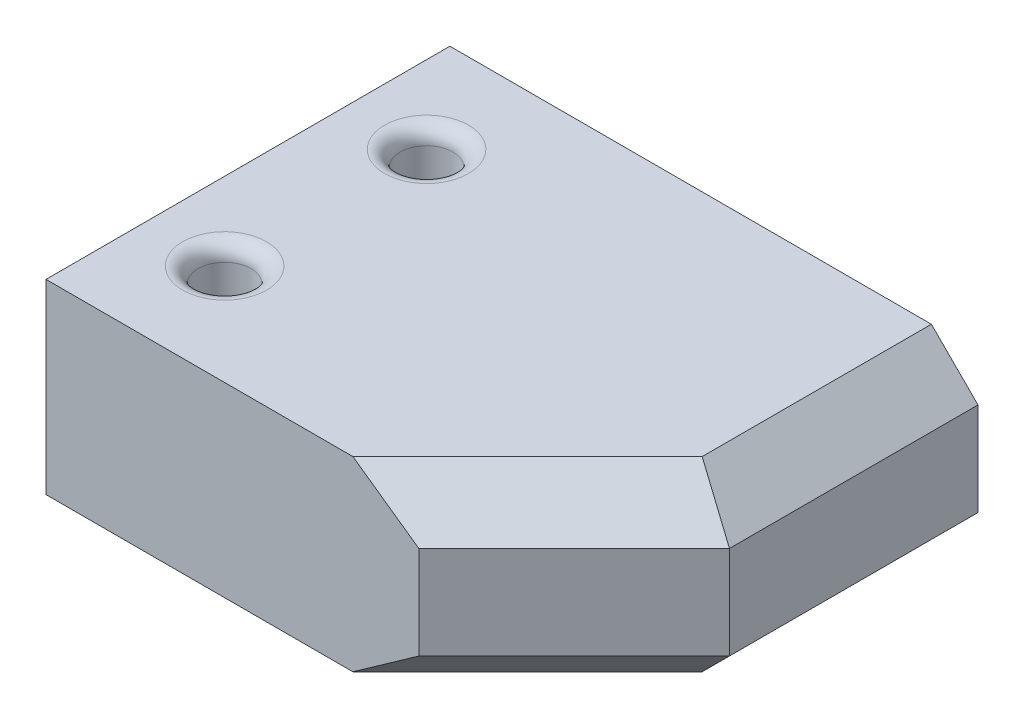
ISO-10303-21;
HEADER;
FILE_DESCRIPTION(('STEP AP214'),'2;1');
FILE_NAME('part.step','',(''),(''),'','','');
FILE_SCHEMA(('AUTOMOTIVE_DESIGN { 1 0 10303 214 1 1 1 1 }'));
ENDSEC;
DATA;
#1=APPLICATION_CONTEXT('core data for automotive mechanical design processes');
#2=APPLICATION_PROTOCOL_DEFINITION('international standard','automotive_design',2000,#1);
#3=PRODUCT_CONTEXT('',#1,'mechanical');
#4=PRODUCT('Part','Part','',(#3));
#5=PRODUCT_RELATED_PRODUCT_CATEGORY('part','',(#4));
#6=PRODUCT_DEFINITION_FORMATION('','',#4);
#7=PRODUCT_DEFINITION_CONTEXT('part definition',#1,'design');
#8=PRODUCT_DEFINITION('design','',#6,#7);
#9=PRODUCT_DEFINITION_SHAPE('','',#8);
#10=(LENGTH_UNIT() NAMED_UNIT(*) SI_UNIT(.MILLI.,.METRE.));
#11=(NAMED_UNIT(*) PLANE_ANGLE_UNIT() SI_UNIT($,.RADIAN.));
#12=(NAMED_UNIT(*) SI_UNIT($,.STERADIAN.) SOLID_ANGLE_UNIT());
#13=UNCERTAINTY_MEASURE_WITH_UNIT(LENGTH_MEASURE(1.E-05),#10,'distance_accuracy_value','');
#14=(GEOMETRIC_REPRESENTATION_CONTEXT(3) GLOBAL_UNCERTAINTY_ASSIGNED_CONTEXT((#13)) GLOBAL_UNIT_ASSIGNED_CONTEXT((#10,
#11,#12)) REPRESENTATION_CONTEXT('',''));
#15=CARTESIAN_POINT('',(0.,0.,0.));
#16=DIRECTION('',(0.,0.,1.));
#17=DIRECTION('',(1.,0.,0.));
#18=AXIS2_PLACEMENT_3D('',#15,#16,#17);
#19=CARTESIAN_POINT('',(0.,6.,-6.5));
#20=DIRECTION('',(0.,0.,1.));
#21=DIRECTION('',(1.,0.,0.));
#22=AXIS2_PLACEMENT_3D('',#19,#20,#21);
#23=PLANE('',#22);
#24=DIRECTION('',(0.,-1.,0.));
#25=VECTOR('',#24,1.);
#26=CARTESIAN_POINT('',(17.,6.,-6.5));
#27=LINE('',#26,#25);
#28=CARTESIAN_POINT('',(17.,4.5,-6.5));
#29=VERTEX_POINT('',#28);
#30=CARTESIAN_POINT('',(17.,1.5,-6.5));
#31=VERTEX_POINT('',#30);
#32=EDGE_CURVE('E128',#29,#31,#27,.T.);
#33=ORIENTED_EDGE('',*,*,#32,.T.);
#34=DIRECTION('',(-0.707106781186546,-0.707106781186549,0.));
#35=VECTOR('',#34,1.);
#36=CARTESIAN_POINT('',(17.,1.5,-6.5));
#37=LINE('',#36,#35);
#38=CARTESIAN_POINT('',(15.5,0.,-6.5));
#39=VERTEX_POINT('',#38);
#40=EDGE_CURVE('E164',#31,#39,#37,.T.);
#41=ORIENTED_EDGE('',*,*,#40,.T.);
#42=DIRECTION('',(-1.,0.,0.));
#43=VECTOR('',#42,1.);
#44=CARTESIAN_POINT('',(0.,0.,-6.5));
#45=LINE('',#44,#43);
#46=CARTESIAN_POINT('',(0.,0.,-6.5));
#47=VERTEX_POINT('',#46);
#48=EDGE_CURVE('E121',#39,#47,#45,.T.);
#49=ORIENTED_EDGE('',*,*,#48,.T.);
#50=DIRECTION('',(0.,-1.,0.));
#51=VECTOR('',#50,1.);
#52=CARTESIAN_POINT('',(0.,6.,-6.5));
#53=LINE('',#52,#51);
#54=CARTESIAN_POINT('',(0.,6.,-6.5));
#55=VERTEX_POINT('',#54);
#56=EDGE_CURVE('E114',#55,#47,#53,.T.);
#57=ORIENTED_EDGE('',*,*,#56,.F.);
#58=DIRECTION('',(-1.,0.,0.));
#59=VECTOR('',#58,1.);
#60=CARTESIAN_POINT('',(0.,6.,-6.5));
#61=LINE('',#60,#59);
#62=CARTESIAN_POINT('',(15.5,6.,-6.5));
#63=VERTEX_POINT('',#62);
#64=EDGE_CURVE('E101',#63,#55,#61,.T.);
#65=ORIENTED_EDGE('',*,*,#64,.F.);
#66=DIRECTION('',(-0.707106781186546,0.707106781186549,0.));
#67=VECTOR('',#66,1.);
#68=CARTESIAN_POINT('',(15.5,6.,-6.5));
#69=LINE('',#68,#67);
#70=EDGE_CURVE('E162',#63,#29,#69,.F.);
#71=ORIENTED_EDGE('',*,*,#70,.T.);
#72=EDGE_LOOP('',(#33,#41,#49,#57,#65,#71));
#73=FACE_BOUND('',#72,.T.);
#74=ADVANCED_FACE('F34',(#73),#23,.F.);
#75=CARTESIAN_POINT('',(0.,6.,6.5));
#76=DIRECTION('',(1.,0.,0.));
#77=DIRECTION('',(0.,0.,-1.));
#78=AXIS2_PLACEMENT_3D('',#75,#76,#77);
#79=PLANE('',#78);
#80=DIRECTION('',(0.,0.,1.));
#81=VECTOR('',#80,1.);
#82=CARTESIAN_POINT('',(0.,0.,6.5));
#83=LINE('',#82,#81);
#84=CARTESIAN_POINT('',(0.,0.,6.5));
#85=VERTEX_POINT('',#84);
#86=EDGE_CURVE('E183',#47,#85,#83,.T.);
#87=ORIENTED_EDGE('',*,*,#86,.T.);
#88=DIRECTION('',(0.,-1.,0.));
#89=VECTOR('',#88,1.);
#90=CARTESIAN_POINT('',(0.,6.,6.5));
#91=LINE('',#90,#89);
#92=CARTESIAN_POINT('',(0.,6.,6.5));
#93=VERTEX_POINT('',#92);
#94=EDGE_CURVE('E116',#93,#85,#91,.T.);
#95=ORIENTED_EDGE('',*,*,#94,.F.);
#96=DIRECTION('',(0.,0.,1.));
#97=VECTOR('',#96,1.);
#98=CARTESIAN_POINT('',(0.,6.,6.5));
#99=LINE('',#98,#97);
#100=EDGE_CURVE('E104',#55,#93,#99,.T.);
#101=ORIENTED_EDGE('',*,*,#100,.F.);
#102=ORIENTED_EDGE('',*,*,#56,.T.);
#103=EDGE_LOOP('',(#87,#95,#101,#102));
#104=FACE_BOUND('',#103,.T.);
#105=ADVANCED_FACE('F113',(#104),#79,.F.);
#106=CARTESIAN_POINT('',(17.,6.,6.49999999999999));
#107=DIRECTION('',(0.,0.,-1.));
#108=DIRECTION('',(-1.,0.,0.));
#109=AXIS2_PLACEMENT_3D('',#106,#107,#108);
#110=PLANE('',#109);
#111=DIRECTION('',(1.,0.,0.));
#112=VECTOR('',#111,1.);
#113=CARTESIAN_POINT('',(17.,0.,6.49999999999999));
#114=LINE('',#113,#112);
#115=CARTESIAN_POINT('',(9.87867965644033,0.,6.5));
#116=VERTEX_POINT('',#115);
#117=EDGE_CURVE('E109',#85,#116,#114,.T.);
#118=ORIENTED_EDGE('',*,*,#117,.T.);
#119=DIRECTION('',(0.816496580927726,0.577350269189626,0.));
#120=VECTOR('',#119,1.);
#121=CARTESIAN_POINT('',(8.75245310429355,-0.796362432175339,6.5));
#122=LINE('',#121,#120);
#123=CARTESIAN_POINT('',(12.,1.5,6.5));
#124=VERTEX_POINT('',#123);
#125=EDGE_CURVE('E171',#116,#124,#122,.T.);
#126=ORIENTED_EDGE('',*,*,#125,.T.);
#127=DIRECTION('',(0.,1.,0.));
#128=VECTOR('',#127,1.);
#129=CARTESIAN_POINT('',(12.,6.,6.5));
#130=LINE('',#129,#128);
#131=CARTESIAN_POINT('',(12.,4.5,6.5));
#132=VERTEX_POINT('',#131);
#133=EDGE_CURVE('E155',#124,#132,#130,.T.);
#134=ORIENTED_EDGE('',*,*,#133,.T.);
#135=DIRECTION('',(0.816496580927726,-0.577350269189626,0.));
#136=VECTOR('',#135,1.);
#137=CARTESIAN_POINT('',(8.75245310429355,6.79636243217534,6.5));
#138=LINE('',#137,#136);
#139=CARTESIAN_POINT('',(9.87867965644034,6.,6.5));
#140=VERTEX_POINT('',#139);
#141=EDGE_CURVE('E58',#132,#140,#138,.F.);
#142=ORIENTED_EDGE('',*,*,#141,.T.);
#143=DIRECTION('',(1.,0.,0.));
#144=VECTOR('',#143,1.);
#145=CARTESIAN_POINT('',(17.,6.,6.49999999999999));
#146=LINE('',#145,#144);
#147=EDGE_CURVE('E117',#93,#140,#146,.T.);
#148=ORIENTED_EDGE('',*,*,#147,.F.);
#149=ORIENTED_EDGE('',*,*,#94,.T.);
#150=EDGE_LOOP('',(#118,#126,#134,#142,#148,#149));
#151=FACE_BOUND('',#150,.T.);
#152=ADVANCED_FACE('F197',(#151),#110,.F.);
#153=CARTESIAN_POINT('',(17.,6.,-6.5));
#154=DIRECTION('',(-1.,0.,0.));
#155=DIRECTION('',(0.,0.,1.));
#156=AXIS2_PLACEMENT_3D('',#153,#154,#155);
#157=PLANE('',#156);
#158=DIRECTION('',(0.,-1.,0.));
#159=VECTOR('',#158,1.);
#160=CARTESIAN_POINT('',(17.,6.,1.49999999999999));
#161=LINE('',#160,#159);
#162=CARTESIAN_POINT('',(17.,4.5,1.49999999999999));
#163=VERTEX_POINT('',#162);
#164=CARTESIAN_POINT('',(17.,1.5,1.49999999999999));
#165=VERTEX_POINT('',#164);
#166=EDGE_CURVE('E152',#163,#165,#161,.T.);
#167=ORIENTED_EDGE('',*,*,#166,.T.);
#168=DIRECTION('',(0.,0.,-1.));
#169=VECTOR('',#168,1.);
#170=CARTESIAN_POINT('',(17.,1.5,-6.5));
#171=LINE('',#170,#169);
#172=EDGE_CURVE('E159',#165,#31,#171,.T.);
#173=ORIENTED_EDGE('',*,*,#172,.T.);
#174=ORIENTED_EDGE('',*,*,#32,.F.);
#175=DIRECTION('',(0.,0.,1.));
#176=VECTOR('',#175,1.);
#177=CARTESIAN_POINT('',(17.,4.5,-6.5));
#178=LINE('',#177,#176);
#179=EDGE_CURVE('E157',#29,#163,#178,.T.);
#180=ORIENTED_EDGE('',*,*,#179,.T.);
#181=EDGE_LOOP('',(#167,#173,#174,#180));
#182=FACE_BOUND('',#181,.T.);
#183=ADVANCED_FACE('F204',(#182),#157,.F.);
#184=CARTESIAN_POINT('',(0.,6.,0.));
#185=DIRECTION('',(0.,-1.,0.));
#186=DIRECTION('',(0.,0.,-1.));
#187=AXIS2_PLACEMENT_3D('',#184,#185,#186);
#188=PLANE('',#187);
#189=CARTESIAN_POINT('',(2.5,6.,3.25));
#190=DIRECTION('',(0.,-1.,0.));
#191=DIRECTION('',(0.,0.,-1.));
#192=AXIS2_PLACEMENT_3D('',#189,#190,#191);
#193=CIRCLE('',#192,1.35);
#194=CARTESIAN_POINT('',(2.5,6.,1.9));
#195=VERTEX_POINT('',#194);
#196=EDGE_CURVE('E149',#195,#195,#193,.T.);
#197=ORIENTED_EDGE('',*,*,#196,.T.);
#198=EDGE_LOOP('',(#197));
#199=FACE_BOUND('',#198,.T.);
#200=CARTESIAN_POINT('',(2.5,6.,-3.25));
#201=DIRECTION('',(0.,-1.,0.));
#202=DIRECTION('',(0.,0.,-1.));
#203=AXIS2_PLACEMENT_3D('',#200,#201,#202);
#204=CIRCLE('',#203,1.35);
#205=CARTESIAN_POINT('',(2.5,6.,-4.6));
#206=VERTEX_POINT('',#205);
#207=EDGE_CURVE('E146',#206,#206,#204,.T.);
#208=ORIENTED_EDGE('',*,*,#207,.T.);
#209=EDGE_LOOP('',(#208));
#210=FACE_BOUND('',#209,.T.);
#211=DIRECTION('',(0.707106781186548,0.,-0.707106781186547));
#212=VECTOR('',#211,1.);
#213=CARTESIAN_POINT('',(15.9393398282202,6.,0.439339828220167));
#214=LINE('',#213,#212);
#215=CARTESIAN_POINT('',(15.5,6.,0.878679656440343));
#216=VERTEX_POINT('',#215);
#217=EDGE_CURVE('E44',#140,#216,#214,.T.);
#218=ORIENTED_EDGE('',*,*,#217,.T.);
#219=DIRECTION('',(0.,0.,-1.));
#220=VECTOR('',#219,1.);
#221=CARTESIAN_POINT('',(15.5,6.,0.));
#222=LINE('',#221,#220);
#223=EDGE_CURVE('E11',#216,#63,#222,.T.);
#224=ORIENTED_EDGE('',*,*,#223,.T.);
#225=ORIENTED_EDGE('',*,*,#64,.T.);
#226=ORIENTED_EDGE('',*,*,#100,.T.);
#227=ORIENTED_EDGE('',*,*,#147,.T.);
#228=EDGE_LOOP('',(#218,#224,#225,#226,#227));
#229=FACE_BOUND('',#228,.T.);
#230=ADVANCED_FACE('F103',(#199,#210,#229),#188,.F.);
#231=CARTESIAN_POINT('',(0.,0.,0.));
#232=DIRECTION('',(0.,-1.,0.));
#233=DIRECTION('',(0.,0.,-1.));
#234=AXIS2_PLACEMENT_3D('',#231,#232,#233);
#235=PLANE('',#234);
#236=CARTESIAN_POINT('',(2.5,0.,3.25));
#237=DIRECTION('',(0.,-1.,0.));
#238=DIRECTION('',(0.,0.,-1.));
#239=AXIS2_PLACEMENT_3D('',#236,#237,#238);
#240=CIRCLE('',#239,1.35);
#241=CARTESIAN_POINT('',(2.5,0.,1.9));
#242=VERTEX_POINT('',#241);
#243=EDGE_CURVE('E126',#242,#242,#240,.F.);
#244=ORIENTED_EDGE('',*,*,#243,.T.);
#245=EDGE_LOOP('',(#244));
#246=FACE_BOUND('',#245,.T.);
#247=CARTESIAN_POINT('',(2.5,0.,-3.25));
#248=DIRECTION('',(0.,-1.,0.));
#249=DIRECTION('',(0.,0.,-1.));
#250=AXIS2_PLACEMENT_3D('',#247,#248,#249);
#251=CIRCLE('',#250,1.35);
#252=CARTESIAN_POINT('',(2.5,0.,-4.6));
#253=VERTEX_POINT('',#252);
#254=EDGE_CURVE('E123',#253,#253,#251,.F.);
#255=ORIENTED_EDGE('',*,*,#254,.T.);
#256=EDGE_LOOP('',(#255));
#257=FACE_BOUND('',#256,.T.);
#258=ORIENTED_EDGE('',*,*,#48,.F.);
#259=DIRECTION('',(0.,0.,1.));
#260=VECTOR('',#259,1.);
#261=CARTESIAN_POINT('',(15.5,0.,1.49999999999999));
#262=LINE('',#261,#260);
#263=CARTESIAN_POINT('',(15.5,0.,0.878679656440345));
#264=VERTEX_POINT('',#263);
#265=EDGE_CURVE('E168',#39,#264,#262,.T.);
#266=ORIENTED_EDGE('',*,*,#265,.T.);
#267=DIRECTION('',(-0.707106781186548,0.,0.707106781186547));
#268=VECTOR('',#267,1.);
#269=CARTESIAN_POINT('',(8.18933982822015,0.,8.18933982822017));
#270=LINE('',#269,#268);
#271=EDGE_CURVE('E166',#264,#116,#270,.T.);
#272=ORIENTED_EDGE('',*,*,#271,.T.);
#273=ORIENTED_EDGE('',*,*,#117,.F.);
#274=ORIENTED_EDGE('',*,*,#86,.F.);
#275=EDGE_LOOP('',(#258,#266,#272,#273,#274));
#276=FACE_BOUND('',#275,.T.);
#277=ADVANCED_FACE('F210',(#246,#257,#276),#235,.T.);
#278=CARTESIAN_POINT('',(2.5,0.,3.25));
#279=DIRECTION('',(0.,1.,0.));
#280=DIRECTION('',(0.,0.,1.));
#281=AXIS2_PLACEMENT_3D('',#278,#279,#280);
#282=CYLINDRICAL_SURFACE('',#281,0.85);
#283=CARTESIAN_POINT('',(2.5,0.5,3.25));
#284=DIRECTION('',(0.,-1.,0.));
#285=DIRECTION('',(0.,0.,-1.));
#286=AXIS2_PLACEMENT_3D('',#283,#284,#285);
#287=CIRCLE('',#286,0.85);
#288=CARTESIAN_POINT('',(2.5,0.5,2.4));
#289=VERTEX_POINT('',#288);
#290=EDGE_CURVE('E137',#289,#289,#287,.T.);
#291=ORIENTED_EDGE('',*,*,#290,.T.);
#292=EDGE_LOOP('',(#291));
#293=FACE_BOUND('',#292,.T.);
#294=CARTESIAN_POINT('',(2.5,5.5,3.25));
#295=DIRECTION('',(0.,-1.,0.));
#296=DIRECTION('',(0.,0.,-1.));
#297=AXIS2_PLACEMENT_3D('',#294,#295,#296);
#298=CIRCLE('',#297,0.85);
#299=CARTESIAN_POINT('',(2.5,5.5,2.4));
#300=VERTEX_POINT('',#299);
#301=EDGE_CURVE('E134',#300,#300,#298,.F.);
#302=ORIENTED_EDGE('',*,*,#301,.T.);
#303=EDGE_LOOP('',(#302));
#304=FACE_BOUND('',#303,.T.);
#305=ADVANCED_FACE('F316',(#293,#304),#282,.F.);
#306=CARTESIAN_POINT('',(2.5,0.,-3.25));
#307=DIRECTION('',(0.,1.,0.));
#308=DIRECTION('',(0.,0.,1.));
#309=AXIS2_PLACEMENT_3D('',#306,#307,#308);
#310=CYLINDRICAL_SURFACE('',#309,0.85);
#311=CARTESIAN_POINT('',(2.5,0.5,-3.25));
#312=DIRECTION('',(0.,-1.,0.));
#313=DIRECTION('',(0.,0.,-1.));
#314=AXIS2_PLACEMENT_3D('',#311,#312,#313);
#315=CIRCLE('',#314,0.85);
#316=CARTESIAN_POINT('',(2.5,0.5,-4.1));
#317=VERTEX_POINT('',#316);
#318=EDGE_CURVE('E143',#317,#317,#315,.T.);
#319=ORIENTED_EDGE('',*,*,#318,.T.);
#320=EDGE_LOOP('',(#319));
#321=FACE_BOUND('',#320,.T.);
#322=CARTESIAN_POINT('',(2.5,5.5,-3.25));
#323=DIRECTION('',(0.,-1.,0.));
#324=DIRECTION('',(0.,0.,-1.));
#325=AXIS2_PLACEMENT_3D('',#322,#323,#324);
#326=CIRCLE('',#325,0.85);
#327=CARTESIAN_POINT('',(2.5,5.5,-4.1));
#328=VERTEX_POINT('',#327);
#329=EDGE_CURVE('E140',#328,#328,#326,.F.);
#330=ORIENTED_EDGE('',*,*,#329,.T.);
#331=EDGE_LOOP('',(#330));
#332=FACE_BOUND('',#331,.T.);
#333=ADVANCED_FACE('F233',(#321,#332),#310,.F.);
#334=CARTESIAN_POINT('',(2.5,0.5,3.25));
#335=DIRECTION('',(0.,-1.,0.));
#336=DIRECTION('',(0.,0.,-1.));
#337=AXIS2_PLACEMENT_3D('',#334,#335,#336);
#338=TOROIDAL_SURFACE('',#337,1.35,0.5);
#339=ORIENTED_EDGE('',*,*,#290,.F.);
#340=EDGE_LOOP('',(#339));
#341=FACE_BOUND('',#340,.T.);
#342=ORIENTED_EDGE('',*,*,#243,.F.);
#343=EDGE_LOOP('',(#342));
#344=FACE_BOUND('',#343,.T.);
#345=ADVANCED_FACE('F229',(#341,#344),#338,.T.);
#346=CARTESIAN_POINT('',(2.5,0.5,-3.25));
#347=DIRECTION('',(0.,-1.,0.));
#348=DIRECTION('',(0.,0.,-1.));
#349=AXIS2_PLACEMENT_3D('',#346,#347,#348);
#350=TOROIDAL_SURFACE('',#349,1.35,0.5);
#351=ORIENTED_EDGE('',*,*,#318,.F.);
#352=EDGE_LOOP('',(#351));
#353=FACE_BOUND('',#352,.T.);
#354=ORIENTED_EDGE('',*,*,#254,.F.);
#355=EDGE_LOOP('',(#354));
#356=FACE_BOUND('',#355,.T.);
#357=ADVANCED_FACE('F232',(#353,#356),#350,.T.);
#358=CARTESIAN_POINT('',(2.5,5.5,3.25));
#359=DIRECTION('',(0.,-1.,0.));
#360=DIRECTION('',(0.,0.,-1.));
#361=AXIS2_PLACEMENT_3D('',#358,#359,#360);
#362=TOROIDAL_SURFACE('',#361,1.35,0.5);
#363=ORIENTED_EDGE('',*,*,#301,.F.);
#364=EDGE_LOOP('',(#363));
#365=FACE_BOUND('',#364,.T.);
#366=ORIENTED_EDGE('',*,*,#196,.F.);
#367=EDGE_LOOP('',(#366));
#368=FACE_BOUND('',#367,.T.);
#369=ADVANCED_FACE('F237',(#365,#368),#362,.T.);
#370=CARTESIAN_POINT('',(2.5,5.5,-3.25));
#371=DIRECTION('',(0.,-1.,0.));
#372=DIRECTION('',(0.,0.,-1.));
#373=AXIS2_PLACEMENT_3D('',#370,#371,#372);
#374=TOROIDAL_SURFACE('',#373,1.35,0.5);
#375=ORIENTED_EDGE('',*,*,#329,.F.);
#376=EDGE_LOOP('',(#375));
#377=FACE_BOUND('',#376,.T.);
#378=ORIENTED_EDGE('',*,*,#207,.F.);
#379=EDGE_LOOP('',(#378));
#380=FACE_BOUND('',#379,.T.);
#381=ADVANCED_FACE('F241',(#377,#380),#374,.T.);
#382=CARTESIAN_POINT('',(17.,6.,1.49999999999999));
#383=DIRECTION('',(-0.707106781186547,0.,-0.707106781186548));
#384=DIRECTION('',(0.,-1.,0.));
#385=AXIS2_PLACEMENT_3D('',#382,#383,#384);
#386=PLANE('',#385);
#387=ORIENTED_EDGE('',*,*,#133,.F.);
#388=DIRECTION('',(-0.707106781186548,0.,0.707106781186547));
#389=VECTOR('',#388,1.);
#390=CARTESIAN_POINT('',(17.,1.5,1.49999999999999));
#391=LINE('',#390,#389);
#392=EDGE_CURVE('E175',#124,#165,#391,.F.);
#393=ORIENTED_EDGE('',*,*,#392,.T.);
#394=ORIENTED_EDGE('',*,*,#166,.F.);
#395=DIRECTION('',(0.707106781186548,0.,-0.707106781186547));
#396=VECTOR('',#395,1.);
#397=CARTESIAN_POINT('',(12.,4.5,6.5));
#398=LINE('',#397,#396);
#399=EDGE_CURVE('E173',#163,#132,#398,.F.);
#400=ORIENTED_EDGE('',*,*,#399,.T.);
#401=EDGE_LOOP('',(#387,#393,#394,#400));
#402=FACE_BOUND('',#401,.T.);
#403=ADVANCED_FACE('F194',(#402),#386,.F.);
#404=CARTESIAN_POINT('',(8.18933982822015,0.,8.18933982822017));
#405=DIRECTION('',(0.5,-0.707106781186546,0.500000000000001));
#406=DIRECTION('',(0.707106781186548,0.,-0.707106781186547));
#407=AXIS2_PLACEMENT_3D('',#404,#405,#406);
#408=PLANE('',#407);
#409=ORIENTED_EDGE('',*,*,#125,.F.);
#410=ORIENTED_EDGE('',*,*,#271,.F.);
#411=DIRECTION('',(0.678598344545846,0.678598344545848,0.281084637714821));
#412=VECTOR('',#411,1.);
#413=CARTESIAN_POINT('',(13.5279337490678,-1.97206625093219,0.0618230694059696));
#414=LINE('',#413,#412);
#415=EDGE_CURVE('E177',#165,#264,#414,.F.);
#416=ORIENTED_EDGE('',*,*,#415,.F.);
#417=ORIENTED_EDGE('',*,*,#392,.F.);
#418=EDGE_LOOP('',(#409,#410,#416,#417));
#419=FACE_BOUND('',#418,.T.);
#420=ADVANCED_FACE('F202',(#419),#408,.T.);
#421=CARTESIAN_POINT('',(17.,1.5,-6.5));
#422=DIRECTION('',(0.707106781186549,-0.707106781186546,0.));
#423=DIRECTION('',(0.,0.,1.));
#424=AXIS2_PLACEMENT_3D('',#421,#422,#423);
#425=PLANE('',#424);
#426=ORIENTED_EDGE('',*,*,#415,.T.);
#427=ORIENTED_EDGE('',*,*,#265,.F.);
#428=ORIENTED_EDGE('',*,*,#40,.F.);
#429=ORIENTED_EDGE('',*,*,#172,.F.);
#430=EDGE_LOOP('',(#426,#427,#428,#429));
#431=FACE_BOUND('',#430,.T.);
#432=ADVANCED_FACE('F211',(#431),#425,.T.);
#433=CARTESIAN_POINT('',(8.18933982822016,6.,8.18933982822018));
#434=DIRECTION('',(-0.5,-0.707106781186547,-0.500000000000001));
#435=DIRECTION('',(0.707106781186548,0.,-0.707106781186547));
#436=AXIS2_PLACEMENT_3D('',#433,#434,#435);
#437=PLANE('',#436);
#438=ORIENTED_EDGE('',*,*,#141,.F.);
#439=ORIENTED_EDGE('',*,*,#399,.F.);
#440=DIRECTION('',(-0.678598344545846,0.678598344545848,-0.281084637714821));
#441=VECTOR('',#440,1.);
#442=CARTESIAN_POINT('',(13.5279337490678,7.97206625093218,0.0618230694059696));
#443=LINE('',#442,#441);
#444=EDGE_CURVE('E39',#216,#163,#443,.F.);
#445=ORIENTED_EDGE('',*,*,#444,.F.);
#446=ORIENTED_EDGE('',*,*,#217,.F.);
#447=EDGE_LOOP('',(#438,#439,#445,#446));
#448=FACE_BOUND('',#447,.T.);
#449=ADVANCED_FACE('F37',(#448),#437,.F.);
#450=CARTESIAN_POINT('',(15.5,6.,0.));
#451=DIRECTION('',(-0.707106781186549,-0.707106781186546,0.));
#452=DIRECTION('',(0.,0.,-1.));
#453=AXIS2_PLACEMENT_3D('',#450,#451,#452);
#454=PLANE('',#453);
#455=ORIENTED_EDGE('',*,*,#444,.T.);
#456=ORIENTED_EDGE('',*,*,#179,.F.);
#457=ORIENTED_EDGE('',*,*,#70,.F.);
#458=ORIENTED_EDGE('',*,*,#223,.F.);
#459=EDGE_LOOP('',(#455,#456,#457,#458));
#460=FACE_BOUND('',#459,.T.);
#461=ADVANCED_FACE('F188',(#460),#454,.F.);
#462=CLOSED_SHELL('',(#74,#105,#152,#183,#230,#277,#305,#333,#345,#357,#369,#381,#403,#420,#432,
#449,#461));
#463=MANIFOLD_SOLID_BREP('B2',#462);
#464=ADVANCED_BREP_SHAPE_REPRESENTATION('',(#18,#463),#14);
#465=SHAPE_DEFINITION_REPRESENTATION(#9,#464);
ENDSEC;
END-ISO-10303-21;
